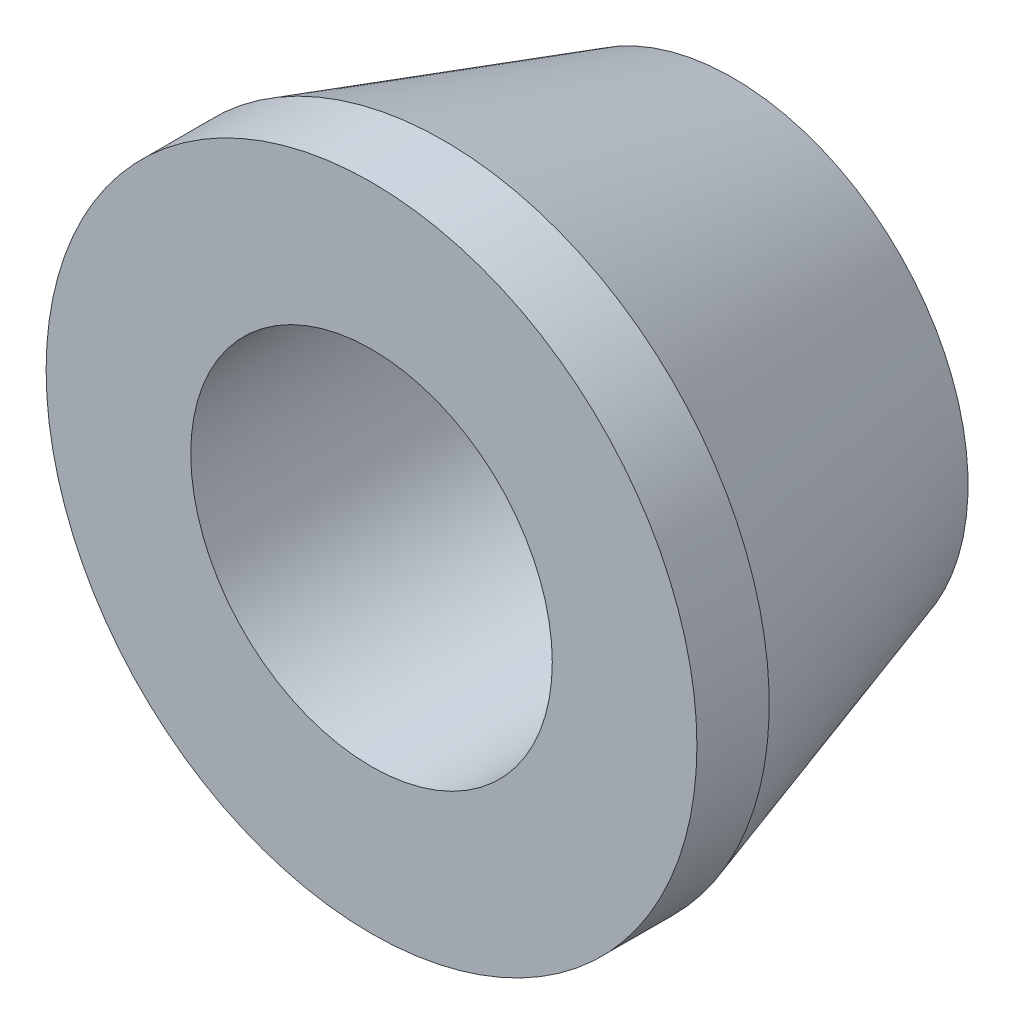
ISO-10303-21;
HEADER;
FILE_DESCRIPTION(('STEP AP214'),'2;1');
FILE_NAME('part.step','',(''),(''),'','','');
FILE_SCHEMA(('AUTOMOTIVE_DESIGN { 1 0 10303 214 1 1 1 1 }'));
ENDSEC;
DATA;
#1=APPLICATION_CONTEXT('core data for automotive mechanical design processes');
#2=APPLICATION_PROTOCOL_DEFINITION('international standard','automotive_design',2000,#1);
#3=PRODUCT_CONTEXT('',#1,'mechanical');
#4=PRODUCT('Part','Part','',(#3));
#5=PRODUCT_RELATED_PRODUCT_CATEGORY('part','',(#4));
#6=PRODUCT_DEFINITION_FORMATION('','',#4);
#7=PRODUCT_DEFINITION_CONTEXT('part definition',#1,'design');
#8=PRODUCT_DEFINITION('design','',#6,#7);
#9=PRODUCT_DEFINITION_SHAPE('','',#8);
#10=(LENGTH_UNIT() NAMED_UNIT(*) SI_UNIT(.MILLI.,.METRE.));
#11=(NAMED_UNIT(*) PLANE_ANGLE_UNIT() SI_UNIT($,.RADIAN.));
#12=(NAMED_UNIT(*) SI_UNIT($,.STERADIAN.) SOLID_ANGLE_UNIT());
#13=UNCERTAINTY_MEASURE_WITH_UNIT(LENGTH_MEASURE(1.E-05),#10,'distance_accuracy_value','');
#14=(GEOMETRIC_REPRESENTATION_CONTEXT(3) GLOBAL_UNCERTAINTY_ASSIGNED_CONTEXT((#13)) GLOBAL_UNIT_ASSIGNED_CONTEXT((#10,
#11,#12)) REPRESENTATION_CONTEXT('',''));
#15=CARTESIAN_POINT('',(0.,0.,0.));
#16=DIRECTION('',(0.,0.,1.));
#17=DIRECTION('',(1.,0.,0.));
#18=AXIS2_PLACEMENT_3D('',#15,#16,#17);
#19=CARTESIAN_POINT('',(0.,0.,2.));
#20=DIRECTION('',(0.,0.,1.));
#21=DIRECTION('',(1.,0.,0.));
#22=AXIS2_PLACEMENT_3D('',#19,#20,#21);
#23=PLANE('',#22);
#24=CARTESIAN_POINT('',(0.,0.,2.));
#25=DIRECTION('',(0.,0.,1.));
#26=DIRECTION('',(1.,0.,0.));
#27=AXIS2_PLACEMENT_3D('',#24,#25,#26);
#28=CIRCLE('',#27,9.);
#29=CARTESIAN_POINT('',(9.,0.,2.));
#30=VERTEX_POINT('',#29);
#31=EDGE_CURVE('E11',#30,#30,#28,.T.);
#32=ORIENTED_EDGE('',*,*,#31,.T.);
#33=EDGE_LOOP('',(#32));
#34=FACE_BOUND('',#33,.T.);
#35=CARTESIAN_POINT('',(0.,0.,2.));
#36=DIRECTION('',(0.,0.,1.));
#37=DIRECTION('',(1.,0.,0.));
#38=AXIS2_PLACEMENT_3D('',#35,#36,#37);
#39=CIRCLE('',#38,5.);
#40=CARTESIAN_POINT('',(5.,0.,2.));
#41=VERTEX_POINT('',#40);
#42=EDGE_CURVE('E41',#41,#41,#39,.T.);
#43=ORIENTED_EDGE('',*,*,#42,.F.);
#44=EDGE_LOOP('',(#43));
#45=FACE_BOUND('',#44,.T.);
#46=ADVANCED_FACE('F34',(#34,#45),#23,.T.);
#47=CARTESIAN_POINT('',(0.,0.,2.));
#48=DIRECTION('',(0.,0.,-1.));
#49=DIRECTION('',(-1.,0.,0.));
#50=AXIS2_PLACEMENT_3D('',#47,#48,#49);
#51=CYLINDRICAL_SURFACE('',#50,9.);
#52=ORIENTED_EDGE('',*,*,#31,.F.);
#53=EDGE_LOOP('',(#52));
#54=FACE_BOUND('',#53,.T.);
#55=CARTESIAN_POINT('',(0.,0.,0.));
#56=DIRECTION('',(0.,0.,-1.));
#57=DIRECTION('',(-1.,0.,0.));
#58=AXIS2_PLACEMENT_3D('',#55,#56,#57);
#59=CIRCLE('',#58,9.);
#60=CARTESIAN_POINT('',(-9.,0.,0.));
#61=VERTEX_POINT('',#60);
#62=EDGE_CURVE('E49',#61,#61,#59,.T.);
#63=ORIENTED_EDGE('',*,*,#62,.F.);
#64=EDGE_LOOP('',(#63));
#65=FACE_BOUND('',#64,.T.);
#66=ADVANCED_FACE('F36',(#54,#65),#51,.T.);
#67=CARTESIAN_POINT('',(0.,0.,2.));
#68=DIRECTION('',(0.,0.,-1.));
#69=DIRECTION('',(-1.,0.,0.));
#70=AXIS2_PLACEMENT_3D('',#67,#68,#69);
#71=CYLINDRICAL_SURFACE('',#70,5.);
#72=ORIENTED_EDGE('',*,*,#42,.T.);
#73=EDGE_LOOP('',(#72));
#74=FACE_BOUND('',#73,.T.);
#75=CARTESIAN_POINT('',(0.,0.,-8.));
#76=DIRECTION('',(0.,0.,-1.));
#77=DIRECTION('',(-1.,0.,0.));
#78=AXIS2_PLACEMENT_3D('',#75,#76,#77);
#79=CIRCLE('',#78,5.);
#80=CARTESIAN_POINT('',(-5.,0.,-8.));
#81=VERTEX_POINT('',#80);
#82=EDGE_CURVE('E86',#81,#81,#79,.T.);
#83=ORIENTED_EDGE('',*,*,#82,.T.);
#84=EDGE_LOOP('',(#83));
#85=FACE_BOUND('',#84,.T.);
#86=ADVANCED_FACE('F70',(#74,#85),#71,.F.);
#87=CARTESIAN_POINT('',(0.,0.,-8.));
#88=DIRECTION('',(0.,0.,-1.));
#89=DIRECTION('',(-1.,0.,0.));
#90=AXIS2_PLACEMENT_3D('',#87,#88,#89);
#91=PLANE('',#90);
#92=ORIENTED_EDGE('',*,*,#82,.F.);
#93=EDGE_LOOP('',(#92));
#94=FACE_BOUND('',#93,.T.);
#95=CARTESIAN_POINT('',(0.,0.,-8.));
#96=DIRECTION('',(0.,0.,-1.));
#97=DIRECTION('',(-1.,0.,0.));
#98=AXIS2_PLACEMENT_3D('',#95,#96,#97);
#99=CIRCLE('',#98,6.5);
#100=CARTESIAN_POINT('',(-6.5,0.,-8.));
#101=VERTEX_POINT('',#100);
#102=EDGE_CURVE('E45',#101,#101,#99,.T.);
#103=ORIENTED_EDGE('',*,*,#102,.T.);
#104=EDGE_LOOP('',(#103));
#105=FACE_BOUND('',#104,.T.);
#106=ADVANCED_FACE('F59',(#94,#105),#91,.T.);
#107=CARTESIAN_POINT('',(0.,0.,-8.));
#108=DIRECTION('',(0.,0.,1.));
#109=DIRECTION('',(1.,0.,0.));
#110=AXIS2_PLACEMENT_3D('',#107,#108,#109);
#111=CONICAL_SURFACE('',#110,6.5,0.302884868374971);
#112=ORIENTED_EDGE('',*,*,#62,.T.);
#113=EDGE_LOOP('',(#112));
#114=FACE_BOUND('',#113,.T.);
#115=ORIENTED_EDGE('',*,*,#102,.F.);
#116=EDGE_LOOP('',(#115));
#117=FACE_BOUND('',#116,.T.);
#118=ADVANCED_FACE('F69',(#114,#117),#111,.T.);
#119=CLOSED_SHELL('',(#46,#66,#86,#106,#118));
#120=MANIFOLD_SOLID_BREP('B2',#119);
#121=ADVANCED_BREP_SHAPE_REPRESENTATION('',(#18,#120),#14);
#122=SHAPE_DEFINITION_REPRESENTATION(#9,#121);
ENDSEC;
END-ISO-10303-21;
